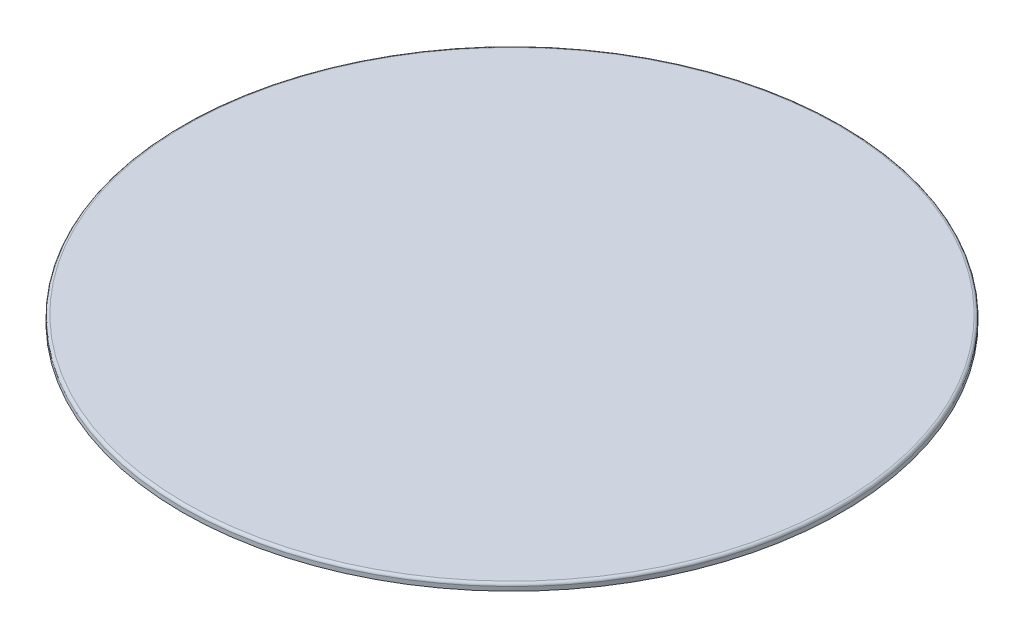
ISO-10303-21;
HEADER;
FILE_DESCRIPTION(('STEP AP214'),'2;1');
FILE_NAME('part.step','',(''),(''),'','','');
FILE_SCHEMA(('AUTOMOTIVE_DESIGN { 1 0 10303 214 1 1 1 1 }'));
ENDSEC;
DATA;
#1=APPLICATION_CONTEXT('core data for automotive mechanical design processes');
#2=APPLICATION_PROTOCOL_DEFINITION('international standard','automotive_design',2000,#1);
#3=PRODUCT_CONTEXT('',#1,'mechanical');
#4=PRODUCT('Part','Part','',(#3));
#5=PRODUCT_RELATED_PRODUCT_CATEGORY('part','',(#4));
#6=PRODUCT_DEFINITION_FORMATION('','',#4);
#7=PRODUCT_DEFINITION_CONTEXT('part definition',#1,'design');
#8=PRODUCT_DEFINITION('design','',#6,#7);
#9=PRODUCT_DEFINITION_SHAPE('','',#8);
#10=(LENGTH_UNIT() NAMED_UNIT(*) SI_UNIT(.MILLI.,.METRE.));
#11=(NAMED_UNIT(*) PLANE_ANGLE_UNIT() SI_UNIT($,.RADIAN.));
#12=(NAMED_UNIT(*) SI_UNIT($,.STERADIAN.) SOLID_ANGLE_UNIT());
#13=UNCERTAINTY_MEASURE_WITH_UNIT(LENGTH_MEASURE(1.E-05),#10,'distance_accuracy_value','');
#14=(GEOMETRIC_REPRESENTATION_CONTEXT(3) GLOBAL_UNCERTAINTY_ASSIGNED_CONTEXT((#13)) GLOBAL_UNIT_ASSIGNED_CONTEXT((#10,
#11,#12)) REPRESENTATION_CONTEXT('',''));
#15=CARTESIAN_POINT('',(0.,0.,0.));
#16=DIRECTION('',(0.,0.,1.));
#17=DIRECTION('',(1.,0.,0.));
#18=AXIS2_PLACEMENT_3D('',#15,#16,#17);
#19=CARTESIAN_POINT('',(0.,0.5,0.));
#20=DIRECTION('',(0.,-1.,0.));
#21=DIRECTION('',(0.,0.,-1.));
#22=AXIS2_PLACEMENT_3D('',#19,#20,#21);
#23=CYLINDRICAL_SURFACE('',#22,24.1);
#24=CARTESIAN_POINT('',(0.,0.3,0.));
#25=DIRECTION('',(0.,1.,0.));
#26=DIRECTION('',(0.,0.,1.));
#27=AXIS2_PLACEMENT_3D('',#24,#25,#26);
#28=CIRCLE('',#27,24.1);
#29=CARTESIAN_POINT('',(0.,0.3,24.1));
#30=VERTEX_POINT('',#29);
#31=EDGE_CURVE('E10',#30,#30,#28,.F.);
#32=ORIENTED_EDGE('',*,*,#31,.T.);
#33=EDGE_LOOP('',(#32));
#34=FACE_BOUND('',#33,.T.);
#35=CARTESIAN_POINT('',(0.,0.,0.));
#36=DIRECTION('',(0.,1.,0.));
#37=DIRECTION('',(0.,0.,1.));
#38=AXIS2_PLACEMENT_3D('',#35,#36,#37);
#39=CIRCLE('',#38,24.1);
#40=CARTESIAN_POINT('',(0.,0.,24.1));
#41=VERTEX_POINT('',#40);
#42=EDGE_CURVE('E41',#41,#41,#39,.T.);
#43=ORIENTED_EDGE('',*,*,#42,.T.);
#44=EDGE_LOOP('',(#43));
#45=FACE_BOUND('',#44,.T.);
#46=ADVANCED_FACE('F30',(#34,#45),#23,.T.);
#47=CARTESIAN_POINT('',(0.,0.5,0.));
#48=DIRECTION('',(0.,1.,0.));
#49=DIRECTION('',(0.,0.,1.));
#50=AXIS2_PLACEMENT_3D('',#47,#48,#49);
#51=PLANE('',#50);
#52=CARTESIAN_POINT('',(0.,0.5,0.));
#53=DIRECTION('',(0.,1.,0.));
#54=DIRECTION('',(0.,0.,1.));
#55=AXIS2_PLACEMENT_3D('',#52,#53,#54);
#56=CIRCLE('',#55,23.9);
#57=CARTESIAN_POINT('',(0.,0.5,23.9));
#58=VERTEX_POINT('',#57);
#59=EDGE_CURVE('E37',#58,#58,#56,.T.);
#60=ORIENTED_EDGE('',*,*,#59,.T.);
#61=EDGE_LOOP('',(#60));
#62=FACE_BOUND('',#61,.T.);
#63=ADVANCED_FACE('F51',(#62),#51,.T.);
#64=CARTESIAN_POINT('',(0.,0.,0.));
#65=DIRECTION('',(0.,1.,0.));
#66=DIRECTION('',(0.,0.,1.));
#67=AXIS2_PLACEMENT_3D('',#64,#65,#66);
#68=PLANE('',#67);
#69=ORIENTED_EDGE('',*,*,#42,.F.);
#70=EDGE_LOOP('',(#69));
#71=FACE_BOUND('',#70,.T.);
#72=ADVANCED_FACE('F49',(#71),#68,.F.);
#73=CARTESIAN_POINT('',(0.,0.3,0.));
#74=DIRECTION('',(0.,1.,0.));
#75=DIRECTION('',(0.,0.,1.));
#76=AXIS2_PLACEMENT_3D('',#73,#74,#75);
#77=TOROIDAL_SURFACE('',#76,23.9,0.2);
#78=ORIENTED_EDGE('',*,*,#31,.F.);
#79=EDGE_LOOP('',(#78));
#80=FACE_BOUND('',#79,.T.);
#81=ORIENTED_EDGE('',*,*,#59,.F.);
#82=EDGE_LOOP('',(#81));
#83=FACE_BOUND('',#82,.T.);
#84=ADVANCED_FACE('F32',(#80,#83),#77,.T.);
#85=CLOSED_SHELL('',(#46,#63,#72,#84));
#86=MANIFOLD_SOLID_BREP('B2',#85);
#87=ADVANCED_BREP_SHAPE_REPRESENTATION('',(#18,#86),#14);
#88=SHAPE_DEFINITION_REPRESENTATION(#9,#87);
ENDSEC;
END-ISO-10303-21;
